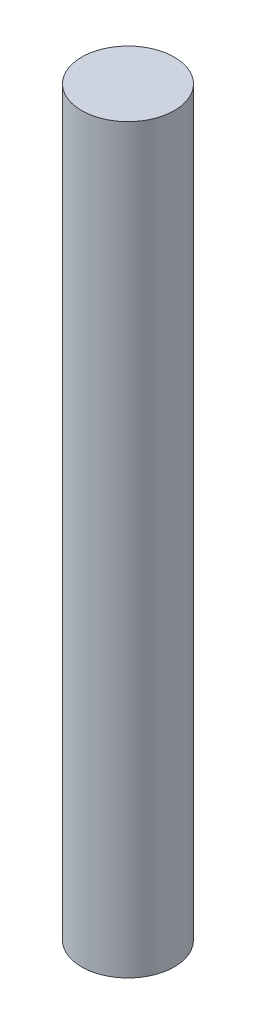
ISO-10303-21;
HEADER;
FILE_DESCRIPTION(('STEP AP214'),'2;1');
FILE_NAME('part.step','',(''),(''),'','','');
FILE_SCHEMA(('AUTOMOTIVE_DESIGN { 1 0 10303 214 1 1 1 1 }'));
ENDSEC;
DATA;
#1=APPLICATION_CONTEXT('core data for automotive mechanical design processes');
#2=APPLICATION_PROTOCOL_DEFINITION('international standard','automotive_design',2000,#1);
#3=PRODUCT_CONTEXT('',#1,'mechanical');
#4=PRODUCT('Part','Part','',(#3));
#5=PRODUCT_RELATED_PRODUCT_CATEGORY('part','',(#4));
#6=PRODUCT_DEFINITION_FORMATION('','',#4);
#7=PRODUCT_DEFINITION_CONTEXT('part definition',#1,'design');
#8=PRODUCT_DEFINITION('design','',#6,#7);
#9=PRODUCT_DEFINITION_SHAPE('','',#8);
#10=(LENGTH_UNIT() NAMED_UNIT(*) SI_UNIT(.MILLI.,.METRE.));
#11=(NAMED_UNIT(*) PLANE_ANGLE_UNIT() SI_UNIT($,.RADIAN.));
#12=(NAMED_UNIT(*) SI_UNIT($,.STERADIAN.) SOLID_ANGLE_UNIT());
#13=UNCERTAINTY_MEASURE_WITH_UNIT(LENGTH_MEASURE(1.E-05),#10,'distance_accuracy_value','');
#14=(GEOMETRIC_REPRESENTATION_CONTEXT(3) GLOBAL_UNCERTAINTY_ASSIGNED_CONTEXT((#13)) GLOBAL_UNIT_ASSIGNED_CONTEXT((#10,
#11,#12)) REPRESENTATION_CONTEXT('',''));
#15=CARTESIAN_POINT('',(0.,0.,0.));
#16=DIRECTION('',(0.,0.,1.));
#17=DIRECTION('',(1.,0.,0.));
#18=AXIS2_PLACEMENT_3D('',#15,#16,#17);
#19=CARTESIAN_POINT('',(0.,20.,0.));
#20=DIRECTION('',(0.,-1.,0.));
#21=DIRECTION('',(0.,0.,-1.));
#22=AXIS2_PLACEMENT_3D('',#19,#20,#21);
#23=CYLINDRICAL_SURFACE('',#22,2.5);
#24=CARTESIAN_POINT('',(0.,20.,0.));
#25=DIRECTION('',(0.,1.,0.));
#26=DIRECTION('',(0.,0.,1.));
#27=AXIS2_PLACEMENT_3D('',#24,#25,#26);
#28=CIRCLE('',#27,2.5);
#29=CARTESIAN_POINT('',(0.,20.,2.5));
#30=VERTEX_POINT('',#29);
#31=EDGE_CURVE('E10',#30,#30,#28,.T.);
#32=ORIENTED_EDGE('',*,*,#31,.F.);
#33=EDGE_LOOP('',(#32));
#34=FACE_BOUND('',#33,.T.);
#35=CARTESIAN_POINT('',(0.,-20.,0.));
#36=DIRECTION('',(0.,1.,0.));
#37=DIRECTION('',(0.,0.,1.));
#38=AXIS2_PLACEMENT_3D('',#35,#36,#37);
#39=CIRCLE('',#38,2.5);
#40=CARTESIAN_POINT('',(0.,-20.,2.5));
#41=VERTEX_POINT('',#40);
#42=EDGE_CURVE('E36',#41,#41,#39,.T.);
#43=ORIENTED_EDGE('',*,*,#42,.T.);
#44=EDGE_LOOP('',(#43));
#45=FACE_BOUND('',#44,.T.);
#46=ADVANCED_FACE('F33',(#34,#45),#23,.T.);
#47=CARTESIAN_POINT('',(0.,20.,0.));
#48=DIRECTION('',(0.,1.,0.));
#49=DIRECTION('',(0.,0.,1.));
#50=AXIS2_PLACEMENT_3D('',#47,#48,#49);
#51=PLANE('',#50);
#52=ORIENTED_EDGE('',*,*,#31,.T.);
#53=EDGE_LOOP('',(#52));
#54=FACE_BOUND('',#53,.T.);
#55=ADVANCED_FACE('F48',(#54),#51,.T.);
#56=CARTESIAN_POINT('',(0.,-20.,0.));
#57=DIRECTION('',(0.,1.,0.));
#58=DIRECTION('',(0.,0.,1.));
#59=AXIS2_PLACEMENT_3D('',#56,#57,#58);
#60=PLANE('',#59);
#61=ORIENTED_EDGE('',*,*,#42,.F.);
#62=EDGE_LOOP('',(#61));
#63=FACE_BOUND('',#62,.T.);
#64=ADVANCED_FACE('F46',(#63),#60,.F.);
#65=CLOSED_SHELL('',(#46,#55,#64));
#66=MANIFOLD_SOLID_BREP('B2',#65);
#67=ADVANCED_BREP_SHAPE_REPRESENTATION('',(#18,#66),#14);
#68=SHAPE_DEFINITION_REPRESENTATION(#9,#67);
ENDSEC;
END-ISO-10303-21;
